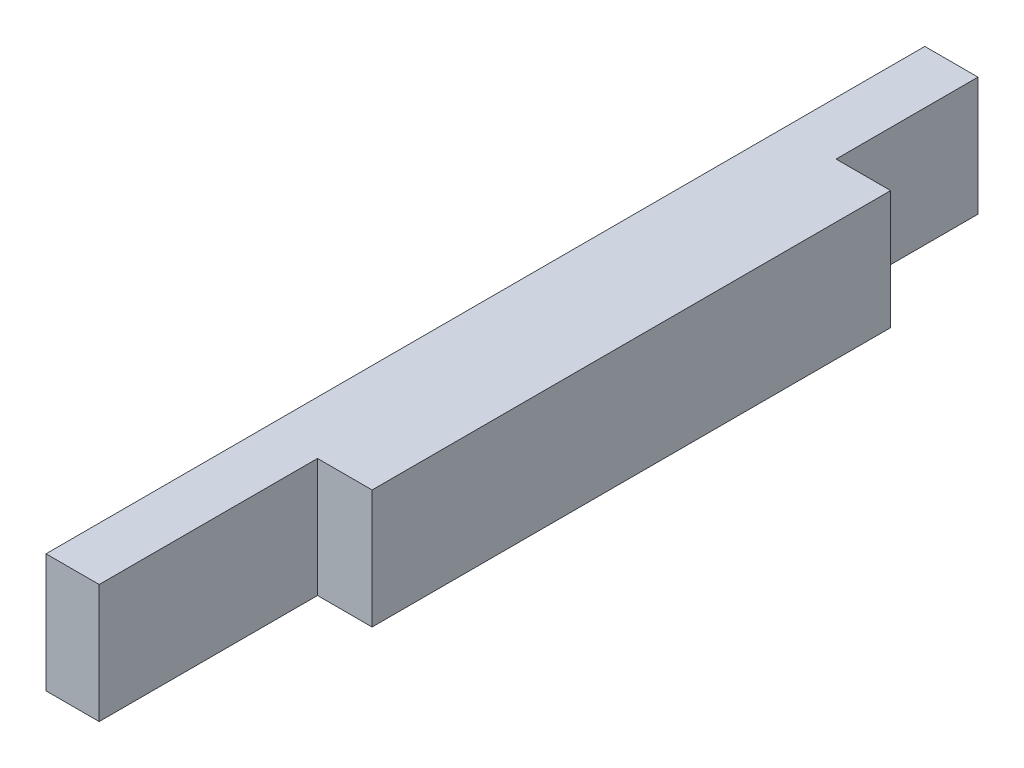
ISO-10303-21;
HEADER;
FILE_DESCRIPTION(('STEP AP214'),'2;1');
FILE_NAME('part.step','',(''),(''),'','','');
FILE_SCHEMA(('AUTOMOTIVE_DESIGN { 1 0 10303 214 1 1 1 1 }'));
ENDSEC;
DATA;
#1=APPLICATION_CONTEXT('core data for automotive mechanical design processes');
#2=APPLICATION_PROTOCOL_DEFINITION('international standard','automotive_design',2000,#1);
#3=PRODUCT_CONTEXT('',#1,'mechanical');
#4=PRODUCT('Part','Part','',(#3));
#5=PRODUCT_RELATED_PRODUCT_CATEGORY('part','',(#4));
#6=PRODUCT_DEFINITION_FORMATION('','',#4);
#7=PRODUCT_DEFINITION_CONTEXT('part definition',#1,'design');
#8=PRODUCT_DEFINITION('design','',#6,#7);
#9=PRODUCT_DEFINITION_SHAPE('','',#8);
#10=(LENGTH_UNIT() NAMED_UNIT(*) SI_UNIT(.MILLI.,.METRE.));
#11=(NAMED_UNIT(*) PLANE_ANGLE_UNIT() SI_UNIT($,.RADIAN.));
#12=(NAMED_UNIT(*) SI_UNIT($,.STERADIAN.) SOLID_ANGLE_UNIT());
#13=UNCERTAINTY_MEASURE_WITH_UNIT(LENGTH_MEASURE(1.E-05),#10,'distance_accuracy_value','');
#14=(GEOMETRIC_REPRESENTATION_CONTEXT(3) GLOBAL_UNCERTAINTY_ASSIGNED_CONTEXT((#13)) GLOBAL_UNIT_ASSIGNED_CONTEXT((#10,
#11,#12)) REPRESENTATION_CONTEXT('',''));
#15=CARTESIAN_POINT('',(0.,0.,0.));
#16=DIRECTION('',(0.,0.,1.));
#17=DIRECTION('',(1.,0.,0.));
#18=AXIS2_PLACEMENT_3D('',#15,#16,#17);
#19=CARTESIAN_POINT('',(0.,11.05,0.));
#20=DIRECTION('',(1.,0.,0.));
#21=DIRECTION('',(0.,0.,-1.));
#22=AXIS2_PLACEMENT_3D('',#19,#20,#21);
#23=PLANE('',#22);
#24=DIRECTION('',(0.,0.,1.));
#25=VECTOR('',#24,1.);
#26=CARTESIAN_POINT('',(0.,0.,0.));
#27=LINE('',#26,#25);
#28=CARTESIAN_POINT('',(0.,0.,-81.79));
#29=VERTEX_POINT('',#28);
#30=CARTESIAN_POINT('',(0.,0.,0.));
#31=VERTEX_POINT('',#30);
#32=EDGE_CURVE('E128',#29,#31,#27,.T.);
#33=ORIENTED_EDGE('',*,*,#32,.T.);
#34=DIRECTION('',(0.,-1.,0.));
#35=VECTOR('',#34,1.);
#36=CARTESIAN_POINT('',(0.,11.05,0.));
#37=LINE('',#36,#35);
#38=CARTESIAN_POINT('',(0.,11.05,0.));
#39=VERTEX_POINT('',#38);
#40=EDGE_CURVE('E11',#39,#31,#37,.T.);
#41=ORIENTED_EDGE('',*,*,#40,.F.);
#42=DIRECTION('',(0.,0.,1.));
#43=VECTOR('',#42,1.);
#44=CARTESIAN_POINT('',(0.,11.05,0.));
#45=LINE('',#44,#43);
#46=CARTESIAN_POINT('',(0.,11.05,-81.79));
#47=VERTEX_POINT('',#46);
#48=EDGE_CURVE('E142',#47,#39,#45,.T.);
#49=ORIENTED_EDGE('',*,*,#48,.F.);
#50=DIRECTION('',(0.,-1.,0.));
#51=VECTOR('',#50,1.);
#52=CARTESIAN_POINT('',(0.,11.05,-81.79));
#53=LINE('',#52,#51);
#54=EDGE_CURVE('E124',#47,#29,#53,.T.);
#55=ORIENTED_EDGE('',*,*,#54,.T.);
#56=EDGE_LOOP('',(#33,#41,#49,#55));
#57=FACE_BOUND('',#56,.T.);
#58=ADVANCED_FACE('F32',(#57),#23,.F.);
#59=CARTESIAN_POINT('',(0.,11.05,0.));
#60=DIRECTION('',(0.,0.,-1.));
#61=DIRECTION('',(-1.,0.,0.));
#62=AXIS2_PLACEMENT_3D('',#59,#60,#61);
#63=PLANE('',#62);
#64=DIRECTION('',(1.,0.,0.));
#65=VECTOR('',#64,1.);
#66=CARTESIAN_POINT('',(0.,0.,0.));
#67=LINE('',#66,#65);
#68=CARTESIAN_POINT('',(4.95,0.,0.));
#69=VERTEX_POINT('',#68);
#70=EDGE_CURVE('E131',#31,#69,#67,.T.);
#71=ORIENTED_EDGE('',*,*,#70,.T.);
#72=DIRECTION('',(0.,-1.,0.));
#73=VECTOR('',#72,1.);
#74=CARTESIAN_POINT('',(4.95,11.05,0.));
#75=LINE('',#74,#73);
#76=CARTESIAN_POINT('',(4.95,11.05,0.));
#77=VERTEX_POINT('',#76);
#78=EDGE_CURVE('E40',#77,#69,#75,.T.);
#79=ORIENTED_EDGE('',*,*,#78,.F.);
#80=DIRECTION('',(1.,0.,0.));
#81=VECTOR('',#80,1.);
#82=CARTESIAN_POINT('',(0.,11.05,0.));
#83=LINE('',#82,#81);
#84=EDGE_CURVE('E91',#39,#77,#83,.T.);
#85=ORIENTED_EDGE('',*,*,#84,.F.);
#86=ORIENTED_EDGE('',*,*,#40,.T.);
#87=EDGE_LOOP('',(#71,#79,#85,#86));
#88=FACE_BOUND('',#87,.T.);
#89=ADVANCED_FACE('F177',(#88),#63,.F.);
#90=CARTESIAN_POINT('',(4.95,11.05,0.));
#91=DIRECTION('',(-1.,0.,0.));
#92=DIRECTION('',(0.,0.,1.));
#93=AXIS2_PLACEMENT_3D('',#90,#91,#92);
#94=PLANE('',#93);
#95=DIRECTION('',(0.,0.,-1.));
#96=VECTOR('',#95,1.);
#97=CARTESIAN_POINT('',(4.95,0.,0.));
#98=LINE('',#97,#96);
#99=CARTESIAN_POINT('',(4.95,0.,-20.32));
#100=VERTEX_POINT('',#99);
#101=EDGE_CURVE('E133',#69,#100,#98,.T.);
#102=ORIENTED_EDGE('',*,*,#101,.T.);
#103=DIRECTION('',(0.,-1.,0.));
#104=VECTOR('',#103,1.);
#105=CARTESIAN_POINT('',(4.95,11.05,-20.32));
#106=LINE('',#105,#104);
#107=CARTESIAN_POINT('',(4.95,11.05,-20.32));
#108=VERTEX_POINT('',#107);
#109=EDGE_CURVE('E149',#108,#100,#106,.T.);
#110=ORIENTED_EDGE('',*,*,#109,.F.);
#111=DIRECTION('',(0.,0.,-1.));
#112=VECTOR('',#111,1.);
#113=CARTESIAN_POINT('',(4.95,11.05,0.));
#114=LINE('',#113,#112);
#115=EDGE_CURVE('E157',#77,#108,#114,.T.);
#116=ORIENTED_EDGE('',*,*,#115,.F.);
#117=ORIENTED_EDGE('',*,*,#78,.T.);
#118=EDGE_LOOP('',(#102,#110,#116,#117));
#119=FACE_BOUND('',#118,.T.);
#120=ADVANCED_FACE('F155',(#119),#94,.F.);
#121=CARTESIAN_POINT('',(10.03,11.05,-20.32));
#122=DIRECTION('',(0.,0.,-1.));
#123=DIRECTION('',(-1.,0.,0.));
#124=AXIS2_PLACEMENT_3D('',#121,#122,#123);
#125=PLANE('',#124);
#126=DIRECTION('',(1.,0.,0.));
#127=VECTOR('',#126,1.);
#128=CARTESIAN_POINT('',(10.03,0.,-20.32));
#129=LINE('',#128,#127);
#130=CARTESIAN_POINT('',(10.03,0.,-20.32));
#131=VERTEX_POINT('',#130);
#132=EDGE_CURVE('E135',#100,#131,#129,.T.);
#133=ORIENTED_EDGE('',*,*,#132,.T.);
#134=DIRECTION('',(0.,-1.,0.));
#135=VECTOR('',#134,1.);
#136=CARTESIAN_POINT('',(10.03,11.05,-20.32));
#137=LINE('',#136,#135);
#138=CARTESIAN_POINT('',(10.03,11.05,-20.32));
#139=VERTEX_POINT('',#138);
#140=EDGE_CURVE('E146',#139,#131,#137,.T.);
#141=ORIENTED_EDGE('',*,*,#140,.F.);
#142=DIRECTION('',(1.,0.,0.));
#143=VECTOR('',#142,1.);
#144=CARTESIAN_POINT('',(10.03,11.05,-20.32));
#145=LINE('',#144,#143);
#146=EDGE_CURVE('E169',#108,#139,#145,.T.);
#147=ORIENTED_EDGE('',*,*,#146,.F.);
#148=ORIENTED_EDGE('',*,*,#109,.T.);
#149=EDGE_LOOP('',(#133,#141,#147,#148));
#150=FACE_BOUND('',#149,.T.);
#151=ADVANCED_FACE('F165',(#150),#125,.F.);
#152=CARTESIAN_POINT('',(10.03,11.05,-20.32));
#153=DIRECTION('',(-1.,0.,0.));
#154=DIRECTION('',(0.,0.,1.));
#155=AXIS2_PLACEMENT_3D('',#152,#153,#154);
#156=PLANE('',#155);
#157=DIRECTION('',(0.,0.,-1.));
#158=VECTOR('',#157,1.);
#159=CARTESIAN_POINT('',(10.03,0.,-20.32));
#160=LINE('',#159,#158);
#161=CARTESIAN_POINT('',(10.03,0.,-68.58));
#162=VERTEX_POINT('',#161);
#163=EDGE_CURVE('E137',#131,#162,#160,.T.);
#164=ORIENTED_EDGE('',*,*,#163,.T.);
#165=DIRECTION('',(0.,-1.,0.));
#166=VECTOR('',#165,1.);
#167=CARTESIAN_POINT('',(10.03,11.05,-68.58));
#168=LINE('',#167,#166);
#169=CARTESIAN_POINT('',(10.03,11.05,-68.58));
#170=VERTEX_POINT('',#169);
#171=EDGE_CURVE('E119',#170,#162,#168,.T.);
#172=ORIENTED_EDGE('',*,*,#171,.F.);
#173=DIRECTION('',(0.,0.,-1.));
#174=VECTOR('',#173,1.);
#175=CARTESIAN_POINT('',(10.03,11.05,-20.32));
#176=LINE('',#175,#174);
#177=EDGE_CURVE('E110',#139,#170,#176,.T.);
#178=ORIENTED_EDGE('',*,*,#177,.F.);
#179=ORIENTED_EDGE('',*,*,#140,.T.);
#180=EDGE_LOOP('',(#164,#172,#178,#179));
#181=FACE_BOUND('',#180,.T.);
#182=ADVANCED_FACE('F168',(#181),#156,.F.);
#183=CARTESIAN_POINT('',(10.03,11.05,-68.58));
#184=DIRECTION('',(0.,0.,1.));
#185=DIRECTION('',(1.,0.,0.));
#186=AXIS2_PLACEMENT_3D('',#183,#184,#185);
#187=PLANE('',#186);
#188=DIRECTION('',(-1.,0.,0.));
#189=VECTOR('',#188,1.);
#190=CARTESIAN_POINT('',(10.03,0.,-68.58));
#191=LINE('',#190,#189);
#192=CARTESIAN_POINT('',(4.94999999999993,0.,-68.58));
#193=VERTEX_POINT('',#192);
#194=EDGE_CURVE('E118',#162,#193,#191,.T.);
#195=ORIENTED_EDGE('',*,*,#194,.T.);
#196=DIRECTION('',(0.,-1.,0.));
#197=VECTOR('',#196,1.);
#198=CARTESIAN_POINT('',(4.94999999999993,11.05,-68.58));
#199=LINE('',#198,#197);
#200=CARTESIAN_POINT('',(4.94999999999993,11.05,-68.58));
#201=VERTEX_POINT('',#200);
#202=EDGE_CURVE('E115',#201,#193,#199,.T.);
#203=ORIENTED_EDGE('',*,*,#202,.F.);
#204=DIRECTION('',(-1.,0.,0.));
#205=VECTOR('',#204,1.);
#206=CARTESIAN_POINT('',(10.03,11.05,-68.58));
#207=LINE('',#206,#205);
#208=EDGE_CURVE('E104',#170,#201,#207,.T.);
#209=ORIENTED_EDGE('',*,*,#208,.F.);
#210=ORIENTED_EDGE('',*,*,#171,.T.);
#211=EDGE_LOOP('',(#195,#203,#209,#210));
#212=FACE_BOUND('',#211,.T.);
#213=ADVANCED_FACE('F116',(#212),#187,.F.);
#214=CARTESIAN_POINT('',(4.94999999999992,11.05,-81.79));
#215=DIRECTION('',(-1.,0.,0.));
#216=DIRECTION('',(0.,0.,1.));
#217=AXIS2_PLACEMENT_3D('',#214,#215,#216);
#218=PLANE('',#217);
#219=DIRECTION('',(0.,0.,-1.));
#220=VECTOR('',#219,1.);
#221=CARTESIAN_POINT('',(4.94999999999992,0.,-81.79));
#222=LINE('',#221,#220);
#223=CARTESIAN_POINT('',(4.94999999999992,0.,-81.79));
#224=VERTEX_POINT('',#223);
#225=EDGE_CURVE('E77',#193,#224,#222,.T.);
#226=ORIENTED_EDGE('',*,*,#225,.T.);
#227=DIRECTION('',(0.,-1.,0.));
#228=VECTOR('',#227,1.);
#229=CARTESIAN_POINT('',(4.94999999999992,11.05,-81.79));
#230=LINE('',#229,#228);
#231=CARTESIAN_POINT('',(4.94999999999992,11.05,-81.79));
#232=VERTEX_POINT('',#231);
#233=EDGE_CURVE('E120',#232,#224,#230,.T.);
#234=ORIENTED_EDGE('',*,*,#233,.F.);
#235=DIRECTION('',(0.,0.,-1.));
#236=VECTOR('',#235,1.);
#237=CARTESIAN_POINT('',(4.94999999999992,11.05,-81.79));
#238=LINE('',#237,#236);
#239=EDGE_CURVE('E108',#201,#232,#238,.T.);
#240=ORIENTED_EDGE('',*,*,#239,.F.);
#241=ORIENTED_EDGE('',*,*,#202,.T.);
#242=EDGE_LOOP('',(#226,#234,#240,#241));
#243=FACE_BOUND('',#242,.T.);
#244=ADVANCED_FACE('F122',(#243),#218,.F.);
#245=CARTESIAN_POINT('',(0.,11.05,-81.79));
#246=DIRECTION('',(0.,0.,1.));
#247=DIRECTION('',(1.,0.,0.));
#248=AXIS2_PLACEMENT_3D('',#245,#246,#247);
#249=PLANE('',#248);
#250=DIRECTION('',(-1.,0.,0.));
#251=VECTOR('',#250,1.);
#252=CARTESIAN_POINT('',(0.,0.,-81.79));
#253=LINE('',#252,#251);
#254=EDGE_CURVE('E83',#224,#29,#253,.T.);
#255=ORIENTED_EDGE('',*,*,#254,.T.);
#256=ORIENTED_EDGE('',*,*,#54,.F.);
#257=DIRECTION('',(-1.,0.,0.));
#258=VECTOR('',#257,1.);
#259=CARTESIAN_POINT('',(0.,11.05,-81.79));
#260=LINE('',#259,#258);
#261=EDGE_CURVE('E48',#232,#47,#260,.T.);
#262=ORIENTED_EDGE('',*,*,#261,.F.);
#263=ORIENTED_EDGE('',*,*,#233,.T.);
#264=EDGE_LOOP('',(#255,#256,#262,#263));
#265=FACE_BOUND('',#264,.T.);
#266=ADVANCED_FACE('F193',(#265),#249,.F.);
#267=CARTESIAN_POINT('',(0.,11.05,0.));
#268=DIRECTION('',(0.,-1.,0.));
#269=DIRECTION('',(0.,0.,-1.));
#270=AXIS2_PLACEMENT_3D('',#267,#268,#269);
#271=PLANE('',#270);
#272=ORIENTED_EDGE('',*,*,#48,.T.);
#273=ORIENTED_EDGE('',*,*,#84,.T.);
#274=ORIENTED_EDGE('',*,*,#115,.T.);
#275=ORIENTED_EDGE('',*,*,#146,.T.);
#276=ORIENTED_EDGE('',*,*,#177,.T.);
#277=ORIENTED_EDGE('',*,*,#208,.T.);
#278=ORIENTED_EDGE('',*,*,#239,.T.);
#279=ORIENTED_EDGE('',*,*,#261,.T.);
#280=EDGE_LOOP('',(#272,#273,#274,#275,#276,#277,#278,#279));
#281=FACE_BOUND('',#280,.T.);
#282=ADVANCED_FACE('F106',(#281),#271,.F.);
#283=CARTESIAN_POINT('',(0.,0.,0.));
#284=DIRECTION('',(0.,-1.,0.));
#285=DIRECTION('',(0.,0.,-1.));
#286=AXIS2_PLACEMENT_3D('',#283,#284,#285);
#287=PLANE('',#286);
#288=ORIENTED_EDGE('',*,*,#32,.F.);
#289=ORIENTED_EDGE('',*,*,#254,.F.);
#290=ORIENTED_EDGE('',*,*,#225,.F.);
#291=ORIENTED_EDGE('',*,*,#194,.F.);
#292=ORIENTED_EDGE('',*,*,#163,.F.);
#293=ORIENTED_EDGE('',*,*,#132,.F.);
#294=ORIENTED_EDGE('',*,*,#101,.F.);
#295=ORIENTED_EDGE('',*,*,#70,.F.);
#296=EDGE_LOOP('',(#288,#289,#290,#291,#292,#293,#294,#295));
#297=FACE_BOUND('',#296,.T.);
#298=ADVANCED_FACE('F161',(#297),#287,.T.);
#299=CLOSED_SHELL('',(#58,#89,#120,#151,#182,#213,#244,#266,#282,#298));
#300=MANIFOLD_SOLID_BREP('B2',#299);
#301=ADVANCED_BREP_SHAPE_REPRESENTATION('',(#18,#300),#14);
#302=SHAPE_DEFINITION_REPRESENTATION(#9,#301);
ENDSEC;
END-ISO-10303-21;
